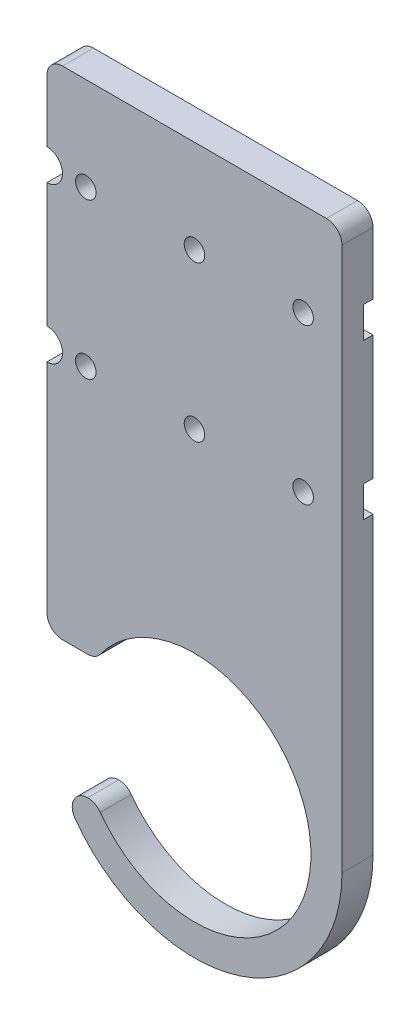
ISO-10303-21;
HEADER;
FILE_DESCRIPTION(('STEP AP214'),'2;1');
FILE_NAME('part.step','',(''),(''),'','','');
FILE_SCHEMA(('AUTOMOTIVE_DESIGN { 1 0 10303 214 1 1 1 1 }'));
ENDSEC;
DATA;
#1=APPLICATION_CONTEXT('core data for automotive mechanical design processes');
#2=APPLICATION_PROTOCOL_DEFINITION('international standard','automotive_design',2000,#1);
#3=PRODUCT_CONTEXT('',#1,'mechanical');
#4=PRODUCT('Part','Part','',(#3));
#5=PRODUCT_RELATED_PRODUCT_CATEGORY('part','',(#4));
#6=PRODUCT_DEFINITION_FORMATION('','',#4);
#7=PRODUCT_DEFINITION_CONTEXT('part definition',#1,'design');
#8=PRODUCT_DEFINITION('design','',#6,#7);
#9=PRODUCT_DEFINITION_SHAPE('','',#8);
#10=(LENGTH_UNIT() NAMED_UNIT(*) SI_UNIT(.MILLI.,.METRE.));
#11=(NAMED_UNIT(*) PLANE_ANGLE_UNIT() SI_UNIT($,.RADIAN.));
#12=(NAMED_UNIT(*) SI_UNIT($,.STERADIAN.) SOLID_ANGLE_UNIT());
#13=UNCERTAINTY_MEASURE_WITH_UNIT(LENGTH_MEASURE(1.E-05),#10,'distance_accuracy_value','');
#14=(GEOMETRIC_REPRESENTATION_CONTEXT(3) GLOBAL_UNCERTAINTY_ASSIGNED_CONTEXT((#13)) GLOBAL_UNIT_ASSIGNED_CONTEXT((#10,
#11,#12)) REPRESENTATION_CONTEXT('',''));
#15=CARTESIAN_POINT('',(0.,0.,0.));
#16=DIRECTION('',(0.,0.,1.));
#17=DIRECTION('',(1.,0.,0.));
#18=AXIS2_PLACEMENT_3D('',#15,#16,#17);
#19=CARTESIAN_POINT('',(0.,0.,0.));
#20=DIRECTION('',(0.,0.,1.));
#21=DIRECTION('',(1.,0.,0.));
#22=AXIS2_PLACEMENT_3D('',#19,#20,#21);
#23=PLANE('',#22);
#24=DIRECTION('',(-1.,0.,0.));
#25=VECTOR('',#24,1.);
#26=CARTESIAN_POINT('',(0.,180.,0.));
#27=LINE('',#26,#25);
#28=CARTESIAN_POINT('',(42.5,180.,0.));
#29=VERTEX_POINT('',#28);
#30=CARTESIAN_POINT('',(-42.5,180.,0.));
#31=VERTEX_POINT('',#30);
#32=EDGE_CURVE('E343',#29,#31,#27,.T.);
#33=ORIENTED_EDGE('',*,*,#32,.F.);
#34=CARTESIAN_POINT('',(42.5,175.,0.));
#35=DIRECTION('',(0.,0.,1.));
#36=DIRECTION('',(1.,0.,0.));
#37=AXIS2_PLACEMENT_3D('',#34,#35,#36);
#38=CIRCLE('',#37,5.);
#39=CARTESIAN_POINT('',(47.5,175.,0.));
#40=VERTEX_POINT('',#39);
#41=EDGE_CURVE('E320',#29,#40,#38,.F.);
#42=ORIENTED_EDGE('',*,*,#41,.T.);
#43=DIRECTION('',(0.,1.,0.));
#44=VECTOR('',#43,1.);
#45=CARTESIAN_POINT('',(47.5,0.,0.));
#46=LINE('',#45,#44);
#47=CARTESIAN_POINT('',(47.5,155.,0.));
#48=VERTEX_POINT('',#47);
#49=EDGE_CURVE('E341',#48,#40,#46,.T.);
#50=ORIENTED_EDGE('',*,*,#49,.F.);
#51=DIRECTION('',(1.,0.,0.));
#52=VECTOR('',#51,1.);
#53=CARTESIAN_POINT('',(0.,155.,0.));
#54=LINE('',#53,#52);
#55=CARTESIAN_POINT('',(-47.5,155.,0.));
#56=VERTEX_POINT('',#55);
#57=EDGE_CURVE('E600',#56,#48,#54,.T.);
#58=ORIENTED_EDGE('',*,*,#57,.F.);
#59=DIRECTION('',(0.,1.,0.));
#60=VECTOR('',#59,1.);
#61=CARTESIAN_POINT('',(-47.5,0.,0.));
#62=LINE('',#61,#60);
#63=CARTESIAN_POINT('',(-47.5,175.,0.));
#64=VERTEX_POINT('',#63);
#65=EDGE_CURVE('E366',#56,#64,#62,.T.);
#66=ORIENTED_EDGE('',*,*,#65,.T.);
#67=CARTESIAN_POINT('',(-42.5,175.,0.));
#68=DIRECTION('',(0.,0.,1.));
#69=DIRECTION('',(1.,0.,0.));
#70=AXIS2_PLACEMENT_3D('',#67,#68,#69);
#71=CIRCLE('',#70,5.);
#72=EDGE_CURVE('E313',#64,#31,#71,.F.);
#73=ORIENTED_EDGE('',*,*,#72,.T.);
#74=EDGE_LOOP('',(#33,#42,#50,#58,#66,#73));
#75=FACE_BOUND('',#74,.T.);
#76=ADVANCED_FACE('F46',(#75),#23,.F.);
#77=DIRECTION('',(0.,1.,0.));
#78=VECTOR('',#77,1.);
#79=CARTESIAN_POINT('',(-47.5,0.,0.));
#80=LINE('',#79,#78);
#81=CARTESIAN_POINT('',(-47.5,105.,0.));
#82=VERTEX_POINT('',#81);
#83=CARTESIAN_POINT('',(-47.5,145.,0.));
#84=VERTEX_POINT('',#83);
#85=EDGE_CURVE('E367',#82,#84,#80,.T.);
#86=ORIENTED_EDGE('',*,*,#85,.T.);
#87=DIRECTION('',(1.,0.,0.));
#88=VECTOR('',#87,1.);
#89=CARTESIAN_POINT('',(0.,145.,0.));
#90=LINE('',#89,#88);
#91=CARTESIAN_POINT('',(47.5,145.,0.));
#92=VERTEX_POINT('',#91);
#93=EDGE_CURVE('E207',#84,#92,#90,.T.);
#94=ORIENTED_EDGE('',*,*,#93,.T.);
#95=CARTESIAN_POINT('',(47.5,105.,0.));
#96=VERTEX_POINT('',#95);
#97=EDGE_CURVE('E354',#96,#92,#46,.T.);
#98=ORIENTED_EDGE('',*,*,#97,.F.);
#99=DIRECTION('',(1.,0.,0.));
#100=VECTOR('',#99,1.);
#101=CARTESIAN_POINT('',(-47.5,105.,0.));
#102=LINE('',#101,#100);
#103=EDGE_CURVE('E631',#82,#96,#102,.T.);
#104=ORIENTED_EDGE('',*,*,#103,.F.);
#105=EDGE_LOOP('',(#86,#94,#98,#104));
#106=FACE_BOUND('',#105,.T.);
#107=ADVANCED_FACE('F488',(#106),#23,.F.);
#108=CARTESIAN_POINT('',(0.,0.,10.));
#109=DIRECTION('',(0.,0.,-1.));
#110=DIRECTION('',(-1.,0.,0.));
#111=AXIS2_PLACEMENT_3D('',#108,#109,#110);
#112=CYLINDRICAL_SURFACE('',#111,37.5);
#113=CARTESIAN_POINT('',(0.,0.,10.));
#114=DIRECTION('',(0.,0.,1.));
#115=DIRECTION('',(1.,0.,0.));
#116=AXIS2_PLACEMENT_3D('',#113,#114,#115);
#117=CIRCLE('',#116,37.5);
#118=CARTESIAN_POINT('',(-30.3258685695607,-22.0588235294118,10.));
#119=VERTEX_POINT('',#118);
#120=CARTESIAN_POINT('',(-30.3258685695607,22.0588235294118,10.));
#121=VERTEX_POINT('',#120);
#122=EDGE_CURVE('E379',#119,#121,#117,.T.);
#123=ORIENTED_EDGE('',*,*,#122,.T.);
#124=DIRECTION('',(0.,0.,-1.));
#125=VECTOR('',#124,1.);
#126=CARTESIAN_POINT('',(-30.3258685695607,22.0588235294118,10.));
#127=LINE('',#126,#125);
#128=CARTESIAN_POINT('',(-30.3258685695607,22.0588235294118,0.));
#129=VERTEX_POINT('',#128);
#130=EDGE_CURVE('E263',#121,#129,#127,.T.);
#131=ORIENTED_EDGE('',*,*,#130,.T.);
#132=CARTESIAN_POINT('',(0.,0.,0.));
#133=DIRECTION('',(0.,0.,1.));
#134=DIRECTION('',(1.,0.,0.));
#135=AXIS2_PLACEMENT_3D('',#132,#133,#134);
#136=CIRCLE('',#135,37.5);
#137=CARTESIAN_POINT('',(-30.3258685695607,-22.0588235294118,0.));
#138=VERTEX_POINT('',#137);
#139=EDGE_CURVE('E356',#138,#129,#136,.T.);
#140=ORIENTED_EDGE('',*,*,#139,.F.);
#141=DIRECTION('',(0.,0.,-1.));
#142=VECTOR('',#141,1.);
#143=CARTESIAN_POINT('',(-30.3258685695607,-22.0588235294118,10.));
#144=LINE('',#143,#142);
#145=EDGE_CURVE('E254',#138,#119,#144,.F.);
#146=ORIENTED_EDGE('',*,*,#145,.T.);
#147=EDGE_LOOP('',(#123,#131,#140,#146));
#148=FACE_BOUND('',#147,.T.);
#149=ADVANCED_FACE('F491',(#148),#112,.F.);
#150=CARTESIAN_POINT('',(0.,0.,10.));
#151=DIRECTION('',(0.,0.,-1.));
#152=DIRECTION('',(-1.,0.,0.));
#153=AXIS2_PLACEMENT_3D('',#150,#151,#152);
#154=CYLINDRICAL_SURFACE('',#153,47.5);
#155=CARTESIAN_POINT('',(0.,0.,10.));
#156=DIRECTION('',(0.,0.,1.));
#157=DIRECTION('',(1.,0.,0.));
#158=AXIS2_PLACEMENT_3D('',#155,#156,#157);
#159=CIRCLE('',#158,47.5);
#160=CARTESIAN_POINT('',(-38.4127668547769,-27.9411764705882,10.));
#161=VERTEX_POINT('',#160);
#162=CARTESIAN_POINT('',(47.5,0.,10.));
#163=VERTEX_POINT('',#162);
#164=EDGE_CURVE('E417',#161,#163,#159,.T.);
#165=ORIENTED_EDGE('',*,*,#164,.F.);
#166=DIRECTION('',(0.,0.,-1.));
#167=VECTOR('',#166,1.);
#168=CARTESIAN_POINT('',(-38.4127668547769,-27.9411764705882,10.));
#169=LINE('',#168,#167);
#170=CARTESIAN_POINT('',(-38.4127668547769,-27.9411764705882,0.));
#171=VERTEX_POINT('',#170);
#172=EDGE_CURVE('E299',#161,#171,#169,.T.);
#173=ORIENTED_EDGE('',*,*,#172,.T.);
#174=CARTESIAN_POINT('',(0.,0.,0.));
#175=DIRECTION('',(0.,0.,1.));
#176=DIRECTION('',(1.,0.,0.));
#177=AXIS2_PLACEMENT_3D('',#174,#175,#176);
#178=CIRCLE('',#177,47.5);
#179=CARTESIAN_POINT('',(47.5,0.,0.));
#180=VERTEX_POINT('',#179);
#181=EDGE_CURVE('E351',#171,#180,#178,.T.);
#182=ORIENTED_EDGE('',*,*,#181,.T.);
#183=DIRECTION('',(0.,0.,-1.));
#184=VECTOR('',#183,1.);
#185=CARTESIAN_POINT('',(47.5,0.,10.));
#186=LINE('',#185,#184);
#187=EDGE_CURVE('E243',#163,#180,#186,.T.);
#188=ORIENTED_EDGE('',*,*,#187,.F.);
#189=EDGE_LOOP('',(#165,#173,#182,#188));
#190=FACE_BOUND('',#189,.T.);
#191=ADVANCED_FACE('F575',(#190),#154,.T.);
#192=CARTESIAN_POINT('',(47.5,0.,10.));
#193=DIRECTION('',(-1.,0.,0.));
#194=DIRECTION('',(0.,0.,1.));
#195=AXIS2_PLACEMENT_3D('',#192,#193,#194);
#196=PLANE('',#195);
#197=ORIENTED_EDGE('',*,*,#49,.T.);
#198=DIRECTION('',(0.,0.,-1.));
#199=VECTOR('',#198,1.);
#200=CARTESIAN_POINT('',(47.5,175.,10.));
#201=LINE('',#200,#199);
#202=CARTESIAN_POINT('',(47.5,175.,10.));
#203=VERTEX_POINT('',#202);
#204=EDGE_CURVE('E67',#40,#203,#201,.F.);
#205=ORIENTED_EDGE('',*,*,#204,.T.);
#206=DIRECTION('',(0.,1.,0.));
#207=VECTOR('',#206,1.);
#208=CARTESIAN_POINT('',(47.5,0.,10.));
#209=LINE('',#208,#207);
#210=EDGE_CURVE('E329',#163,#203,#209,.T.);
#211=ORIENTED_EDGE('',*,*,#210,.F.);
#212=ORIENTED_EDGE('',*,*,#187,.T.);
#213=CARTESIAN_POINT('',(47.5,95.,0.));
#214=VERTEX_POINT('',#213);
#215=EDGE_CURVE('E353',#180,#214,#46,.T.);
#216=ORIENTED_EDGE('',*,*,#215,.T.);
#217=DIRECTION('',(0.,0.,-1.));
#218=VECTOR('',#217,1.);
#219=CARTESIAN_POINT('',(47.5,95.,3.));
#220=LINE('',#219,#218);
#221=CARTESIAN_POINT('',(47.5,95.,3.));
#222=VERTEX_POINT('',#221);
#223=EDGE_CURVE('E619',#222,#214,#220,.T.);
#224=ORIENTED_EDGE('',*,*,#223,.F.);
#225=DIRECTION('',(0.,-1.,0.));
#226=VECTOR('',#225,1.);
#227=CARTESIAN_POINT('',(47.5,105.,3.));
#228=LINE('',#227,#226);
#229=CARTESIAN_POINT('',(47.5,105.,3.));
#230=VERTEX_POINT('',#229);
#231=EDGE_CURVE('E639',#230,#222,#228,.T.);
#232=ORIENTED_EDGE('',*,*,#231,.F.);
#233=DIRECTION('',(0.,0.,-1.));
#234=VECTOR('',#233,1.);
#235=CARTESIAN_POINT('',(47.5,105.,3.));
#236=LINE('',#235,#234);
#237=EDGE_CURVE('E621',#230,#96,#236,.T.);
#238=ORIENTED_EDGE('',*,*,#237,.T.);
#239=ORIENTED_EDGE('',*,*,#97,.T.);
#240=DIRECTION('',(0.,0.,-1.));
#241=VECTOR('',#240,1.);
#242=CARTESIAN_POINT('',(47.5,145.,3.));
#243=LINE('',#242,#241);
#244=CARTESIAN_POINT('',(47.5,145.,3.));
#245=VERTEX_POINT('',#244);
#246=EDGE_CURVE('E214',#245,#92,#243,.T.);
#247=ORIENTED_EDGE('',*,*,#246,.F.);
#248=DIRECTION('',(0.,1.,0.));
#249=VECTOR('',#248,1.);
#250=CARTESIAN_POINT('',(47.5,0.,3.));
#251=LINE('',#250,#249);
#252=CARTESIAN_POINT('',(47.5,155.,3.));
#253=VERTEX_POINT('',#252);
#254=EDGE_CURVE('E224',#245,#253,#251,.T.);
#255=ORIENTED_EDGE('',*,*,#254,.T.);
#256=DIRECTION('',(0.,0.,-1.));
#257=VECTOR('',#256,1.);
#258=CARTESIAN_POINT('',(47.5,155.,3.));
#259=LINE('',#258,#257);
#260=EDGE_CURVE('E349',#253,#48,#259,.T.);
#261=ORIENTED_EDGE('',*,*,#260,.T.);
#262=EDGE_LOOP('',(#197,#205,#211,#212,#216,#224,#232,#238,#239,#247,#255,#261));
#263=FACE_BOUND('',#262,.T.);
#264=ADVANCED_FACE('F350',(#263),#196,.F.);
#265=CARTESIAN_POINT('',(0.,180.,10.));
#266=DIRECTION('',(0.,-1.,0.));
#267=DIRECTION('',(0.,0.,-1.));
#268=AXIS2_PLACEMENT_3D('',#265,#266,#267);
#269=PLANE('',#268);
#270=DIRECTION('',(-1.,0.,0.));
#271=VECTOR('',#270,1.);
#272=CARTESIAN_POINT('',(0.,180.,10.));
#273=LINE('',#272,#271);
#274=CARTESIAN_POINT('',(42.5,180.,10.));
#275=VERTEX_POINT('',#274);
#276=CARTESIAN_POINT('',(-42.5,180.,10.));
#277=VERTEX_POINT('',#276);
#278=EDGE_CURVE('E326',#275,#277,#273,.T.);
#279=ORIENTED_EDGE('',*,*,#278,.F.);
#280=DIRECTION('',(0.,0.,-1.));
#281=VECTOR('',#280,1.);
#282=CARTESIAN_POINT('',(42.5,180.,10.));
#283=LINE('',#282,#281);
#284=EDGE_CURVE('E309',#275,#29,#283,.T.);
#285=ORIENTED_EDGE('',*,*,#284,.T.);
#286=ORIENTED_EDGE('',*,*,#32,.T.);
#287=DIRECTION('',(0.,0.,-1.));
#288=VECTOR('',#287,1.);
#289=CARTESIAN_POINT('',(-42.5,180.,10.));
#290=LINE('',#289,#288);
#291=EDGE_CURVE('E305',#31,#277,#290,.F.);
#292=ORIENTED_EDGE('',*,*,#291,.T.);
#293=EDGE_LOOP('',(#279,#285,#286,#292));
#294=FACE_BOUND('',#293,.T.);
#295=ADVANCED_FACE('F335',(#294),#269,.F.);
#296=CARTESIAN_POINT('',(-47.5,0.,10.));
#297=DIRECTION('',(-1.,0.,0.));
#298=DIRECTION('',(0.,0.,1.));
#299=AXIS2_PLACEMENT_3D('',#296,#297,#298);
#300=PLANE('',#299);
#301=DIRECTION('',(0.,1.,0.));
#302=VECTOR('',#301,1.);
#303=CARTESIAN_POINT('',(-47.5,0.,10.));
#304=LINE('',#303,#302);
#305=CARTESIAN_POINT('',(-47.5,155.,10.));
#306=VERTEX_POINT('',#305);
#307=CARTESIAN_POINT('',(-47.5,175.,10.));
#308=VERTEX_POINT('',#307);
#309=EDGE_CURVE('E336',#306,#308,#304,.T.);
#310=ORIENTED_EDGE('',*,*,#309,.T.);
#311=DIRECTION('',(0.,0.,-1.));
#312=VECTOR('',#311,1.);
#313=CARTESIAN_POINT('',(-47.5,175.,0.));
#314=LINE('',#313,#312);
#315=EDGE_CURVE('E11',#308,#64,#314,.T.);
#316=ORIENTED_EDGE('',*,*,#315,.T.);
#317=ORIENTED_EDGE('',*,*,#65,.F.);
#318=DIRECTION('',(0.,0.,-1.));
#319=VECTOR('',#318,1.);
#320=CARTESIAN_POINT('',(-47.5,155.,3.));
#321=LINE('',#320,#319);
#322=CARTESIAN_POINT('',(-47.5,155.,3.));
#323=VERTEX_POINT('',#322);
#324=EDGE_CURVE('E607',#323,#56,#321,.T.);
#325=ORIENTED_EDGE('',*,*,#324,.F.);
#326=DIRECTION('',(0.,0.,-1.));
#327=VECTOR('',#326,1.);
#328=CARTESIAN_POINT('',(-47.5,155.,10.));
#329=LINE('',#328,#327);
#330=EDGE_CURVE('E229',#306,#323,#329,.T.);
#331=ORIENTED_EDGE('',*,*,#330,.F.);
#332=EDGE_LOOP('',(#310,#316,#317,#325,#331));
#333=FACE_BOUND('',#332,.T.);
#334=ADVANCED_FACE('F564',(#333),#300,.T.);
#335=CARTESIAN_POINT('',(-47.5,150.,10.));
#336=DIRECTION('',(0.,0.,-1.));
#337=DIRECTION('',(-1.,0.,0.));
#338=AXIS2_PLACEMENT_3D('',#335,#336,#337);
#339=CYLINDRICAL_SURFACE('',#338,5.);
#340=CARTESIAN_POINT('',(-47.5,150.,3.));
#341=DIRECTION('',(0.,0.,1.));
#342=DIRECTION('',(1.,0.,0.));
#343=AXIS2_PLACEMENT_3D('',#340,#341,#342);
#344=CIRCLE('',#343,5.);
#345=CARTESIAN_POINT('',(-47.5,145.,3.));
#346=VERTEX_POINT('',#345);
#347=EDGE_CURVE('E216',#346,#323,#344,.T.);
#348=ORIENTED_EDGE('',*,*,#347,.F.);
#349=DIRECTION('',(0.,0.,-1.));
#350=VECTOR('',#349,1.);
#351=CARTESIAN_POINT('',(-47.5,145.,10.));
#352=LINE('',#351,#350);
#353=CARTESIAN_POINT('',(-47.5,145.,10.));
#354=VERTEX_POINT('',#353);
#355=EDGE_CURVE('E226',#354,#346,#352,.T.);
#356=ORIENTED_EDGE('',*,*,#355,.F.);
#357=CARTESIAN_POINT('',(-47.5,150.,10.));
#358=DIRECTION('',(0.,0.,1.));
#359=DIRECTION('',(1.,0.,0.));
#360=AXIS2_PLACEMENT_3D('',#357,#358,#359);
#361=CIRCLE('',#360,5.);
#362=EDGE_CURVE('E430',#354,#306,#361,.T.);
#363=ORIENTED_EDGE('',*,*,#362,.T.);
#364=ORIENTED_EDGE('',*,*,#330,.T.);
#365=EDGE_LOOP('',(#348,#356,#363,#364));
#366=FACE_BOUND('',#365,.T.);
#367=ADVANCED_FACE('F228',(#366),#339,.F.);
#368=CARTESIAN_POINT('',(-47.5,0.,10.));
#369=DIRECTION('',(-1.,0.,0.));
#370=DIRECTION('',(0.,0.,1.));
#371=AXIS2_PLACEMENT_3D('',#368,#369,#370);
#372=PLANE('',#371);
#373=ORIENTED_EDGE('',*,*,#85,.F.);
#374=DIRECTION('',(0.,0.,-1.));
#375=VECTOR('',#374,1.);
#376=CARTESIAN_POINT('',(-47.5,105.,3.));
#377=LINE('',#376,#375);
#378=CARTESIAN_POINT('',(-47.5,105.,3.));
#379=VERTEX_POINT('',#378);
#380=EDGE_CURVE('E630',#379,#82,#377,.T.);
#381=ORIENTED_EDGE('',*,*,#380,.F.);
#382=DIRECTION('',(0.,0.,-1.));
#383=VECTOR('',#382,1.);
#384=CARTESIAN_POINT('',(-47.5,105.,10.));
#385=LINE('',#384,#383);
#386=CARTESIAN_POINT('',(-47.5,105.,10.));
#387=VERTEX_POINT('',#386);
#388=EDGE_CURVE('E237',#387,#379,#385,.T.);
#389=ORIENTED_EDGE('',*,*,#388,.F.);
#390=DIRECTION('',(0.,1.,0.));
#391=VECTOR('',#390,1.);
#392=CARTESIAN_POINT('',(-47.5,0.,10.));
#393=LINE('',#392,#391);
#394=EDGE_CURVE('E240',#387,#354,#393,.T.);
#395=ORIENTED_EDGE('',*,*,#394,.T.);
#396=ORIENTED_EDGE('',*,*,#355,.T.);
#397=DIRECTION('',(0.,0.,-1.));
#398=VECTOR('',#397,1.);
#399=CARTESIAN_POINT('',(-47.5,145.,3.));
#400=LINE('',#399,#398);
#401=EDGE_CURVE('E197',#346,#84,#400,.T.);
#402=ORIENTED_EDGE('',*,*,#401,.T.);
#403=EDGE_LOOP('',(#373,#381,#389,#395,#396,#402));
#404=FACE_BOUND('',#403,.T.);
#405=ADVANCED_FACE('F232',(#404),#372,.T.);
#406=CARTESIAN_POINT('',(-47.5,100.,10.));
#407=DIRECTION('',(0.,0.,-1.));
#408=DIRECTION('',(-1.,0.,0.));
#409=AXIS2_PLACEMENT_3D('',#406,#407,#408);
#410=CYLINDRICAL_SURFACE('',#409,5.);
#411=CARTESIAN_POINT('',(-47.5,100.,3.));
#412=DIRECTION('',(0.,0.,1.));
#413=DIRECTION('',(1.,0.,0.));
#414=AXIS2_PLACEMENT_3D('',#411,#412,#413);
#415=CIRCLE('',#414,5.);
#416=CARTESIAN_POINT('',(-47.5,95.,3.));
#417=VERTEX_POINT('',#416);
#418=EDGE_CURVE('E402',#417,#379,#415,.T.);
#419=ORIENTED_EDGE('',*,*,#418,.F.);
#420=DIRECTION('',(0.,0.,-1.));
#421=VECTOR('',#420,1.);
#422=CARTESIAN_POINT('',(-47.5,95.,10.));
#423=LINE('',#422,#421);
#424=CARTESIAN_POINT('',(-47.5,95.,10.));
#425=VERTEX_POINT('',#424);
#426=EDGE_CURVE('E246',#425,#417,#423,.T.);
#427=ORIENTED_EDGE('',*,*,#426,.F.);
#428=CARTESIAN_POINT('',(-47.5,100.,10.));
#429=DIRECTION('',(0.,0.,1.));
#430=DIRECTION('',(1.,0.,0.));
#431=AXIS2_PLACEMENT_3D('',#428,#429,#430);
#432=CIRCLE('',#431,5.);
#433=EDGE_CURVE('E435',#425,#387,#432,.T.);
#434=ORIENTED_EDGE('',*,*,#433,.T.);
#435=ORIENTED_EDGE('',*,*,#388,.T.);
#436=EDGE_LOOP('',(#419,#427,#434,#435));
#437=FACE_BOUND('',#436,.T.);
#438=ADVANCED_FACE('F484',(#437),#410,.F.);
#439=CARTESIAN_POINT('',(-47.5,0.,10.));
#440=DIRECTION('',(-1.,0.,0.));
#441=DIRECTION('',(0.,0.,1.));
#442=AXIS2_PLACEMENT_3D('',#439,#440,#441);
#443=PLANE('',#442);
#444=DIRECTION('',(0.,1.,0.));
#445=VECTOR('',#444,1.);
#446=CARTESIAN_POINT('',(-47.5,0.,0.));
#447=LINE('',#446,#445);
#448=CARTESIAN_POINT('',(-47.5,25.,0.));
#449=VERTEX_POINT('',#448);
#450=CARTESIAN_POINT('',(-47.5,95.,0.));
#451=VERTEX_POINT('',#450);
#452=EDGE_CURVE('E372',#449,#451,#447,.T.);
#453=ORIENTED_EDGE('',*,*,#452,.F.);
#454=DIRECTION('',(0.,0.,-1.));
#455=VECTOR('',#454,1.);
#456=CARTESIAN_POINT('',(-47.5,25.,10.));
#457=LINE('',#456,#455);
#458=CARTESIAN_POINT('',(-47.5,25.,10.));
#459=VERTEX_POINT('',#458);
#460=EDGE_CURVE('E298',#449,#459,#457,.F.);
#461=ORIENTED_EDGE('',*,*,#460,.T.);
#462=DIRECTION('',(0.,1.,0.));
#463=VECTOR('',#462,1.);
#464=CARTESIAN_POINT('',(-47.5,0.,10.));
#465=LINE('',#464,#463);
#466=EDGE_CURVE('E436',#459,#425,#465,.T.);
#467=ORIENTED_EDGE('',*,*,#466,.T.);
#468=ORIENTED_EDGE('',*,*,#426,.T.);
#469=DIRECTION('',(0.,0.,-1.));
#470=VECTOR('',#469,1.);
#471=CARTESIAN_POINT('',(-47.5,95.,3.));
#472=LINE('',#471,#470);
#473=EDGE_CURVE('E310',#417,#451,#472,.T.);
#474=ORIENTED_EDGE('',*,*,#473,.T.);
#475=EDGE_LOOP('',(#453,#461,#467,#468,#474));
#476=FACE_BOUND('',#475,.T.);
#477=ADVANCED_FACE('F468',(#476),#443,.T.);
#478=CARTESIAN_POINT('',(0.,150.,10.));
#479=DIRECTION('',(0.,0.,-1.));
#480=DIRECTION('',(-1.,0.,0.));
#481=AXIS2_PLACEMENT_3D('',#478,#479,#480);
#482=CYLINDRICAL_SURFACE('',#481,3.3);
#483=CARTESIAN_POINT('',(0.,150.,3.));
#484=DIRECTION('',(0.,0.,1.));
#485=DIRECTION('',(1.,0.,0.));
#486=AXIS2_PLACEMENT_3D('',#483,#484,#485);
#487=CIRCLE('',#486,3.3);
#488=CARTESIAN_POINT('',(3.30000000000001,150.,3.));
#489=VERTEX_POINT('',#488);
#490=EDGE_CURVE('E601',#489,#489,#487,.T.);
#491=ORIENTED_EDGE('',*,*,#490,.F.);
#492=EDGE_LOOP('',(#491));
#493=FACE_BOUND('',#492,.T.);
#494=CARTESIAN_POINT('',(0.,150.,10.));
#495=DIRECTION('',(0.,0.,1.));
#496=DIRECTION('',(1.,0.,0.));
#497=AXIS2_PLACEMENT_3D('',#494,#495,#496);
#498=CIRCLE('',#497,3.3);
#499=CARTESIAN_POINT('',(3.30000000000001,150.,10.));
#500=VERTEX_POINT('',#499);
#501=EDGE_CURVE('E386',#500,#500,#498,.T.);
#502=ORIENTED_EDGE('',*,*,#501,.T.);
#503=EDGE_LOOP('',(#502));
#504=FACE_BOUND('',#503,.T.);
#505=ADVANCED_FACE('F466',(#493,#504),#482,.F.);
#506=CARTESIAN_POINT('',(35.,150.,10.));
#507=DIRECTION('',(0.,0.,-1.));
#508=DIRECTION('',(-1.,0.,0.));
#509=AXIS2_PLACEMENT_3D('',#506,#507,#508);
#510=CYLINDRICAL_SURFACE('',#509,3.3);
#511=CARTESIAN_POINT('',(35.,150.,3.));
#512=DIRECTION('',(0.,0.,1.));
#513=DIRECTION('',(1.,0.,0.));
#514=AXIS2_PLACEMENT_3D('',#511,#512,#513);
#515=CIRCLE('',#514,3.3);
#516=CARTESIAN_POINT('',(38.3,150.,3.));
#517=VERTEX_POINT('',#516);
#518=EDGE_CURVE('E599',#517,#517,#515,.T.);
#519=ORIENTED_EDGE('',*,*,#518,.F.);
#520=EDGE_LOOP('',(#519));
#521=FACE_BOUND('',#520,.T.);
#522=CARTESIAN_POINT('',(35.,150.,10.));
#523=DIRECTION('',(0.,0.,1.));
#524=DIRECTION('',(1.,0.,0.));
#525=AXIS2_PLACEMENT_3D('',#522,#523,#524);
#526=CIRCLE('',#525,3.3);
#527=CARTESIAN_POINT('',(38.3,150.,10.));
#528=VERTEX_POINT('',#527);
#529=EDGE_CURVE('E392',#528,#528,#526,.T.);
#530=ORIENTED_EDGE('',*,*,#529,.T.);
#531=EDGE_LOOP('',(#530));
#532=FACE_BOUND('',#531,.T.);
#533=ADVANCED_FACE('F456',(#521,#532),#510,.F.);
#534=CARTESIAN_POINT('',(35.,100.,10.));
#535=DIRECTION('',(0.,0.,-1.));
#536=DIRECTION('',(-1.,0.,0.));
#537=AXIS2_PLACEMENT_3D('',#534,#535,#536);
#538=CYLINDRICAL_SURFACE('',#537,3.3);
#539=CARTESIAN_POINT('',(35.,100.,3.));
#540=DIRECTION('',(0.,0.,1.));
#541=DIRECTION('',(1.,0.,0.));
#542=AXIS2_PLACEMENT_3D('',#539,#540,#541);
#543=CIRCLE('',#542,3.3);
#544=CARTESIAN_POINT('',(38.3,100.,3.));
#545=VERTEX_POINT('',#544);
#546=EDGE_CURVE('E403',#545,#545,#543,.T.);
#547=ORIENTED_EDGE('',*,*,#546,.F.);
#548=EDGE_LOOP('',(#547));
#549=FACE_BOUND('',#548,.T.);
#550=CARTESIAN_POINT('',(35.,100.,10.));
#551=DIRECTION('',(0.,0.,1.));
#552=DIRECTION('',(1.,0.,0.));
#553=AXIS2_PLACEMENT_3D('',#550,#551,#552);
#554=CIRCLE('',#553,3.3);
#555=CARTESIAN_POINT('',(38.3,100.,10.));
#556=VERTEX_POINT('',#555);
#557=EDGE_CURVE('E452',#556,#556,#554,.T.);
#558=ORIENTED_EDGE('',*,*,#557,.T.);
#559=EDGE_LOOP('',(#558));
#560=FACE_BOUND('',#559,.T.);
#561=ADVANCED_FACE('F480',(#549,#560),#538,.F.);
#562=CARTESIAN_POINT('',(0.,100.,10.));
#563=DIRECTION('',(0.,0.,-1.));
#564=DIRECTION('',(-1.,0.,0.));
#565=AXIS2_PLACEMENT_3D('',#562,#563,#564);
#566=CYLINDRICAL_SURFACE('',#565,3.3);
#567=CARTESIAN_POINT('',(0.,100.,3.));
#568=DIRECTION('',(0.,0.,1.));
#569=DIRECTION('',(1.,0.,0.));
#570=AXIS2_PLACEMENT_3D('',#567,#568,#569);
#571=CIRCLE('',#570,3.3);
#572=CARTESIAN_POINT('',(3.30000000000001,100.,3.));
#573=VERTEX_POINT('',#572);
#574=EDGE_CURVE('E260',#573,#573,#571,.T.);
#575=ORIENTED_EDGE('',*,*,#574,.F.);
#576=EDGE_LOOP('',(#575));
#577=FACE_BOUND('',#576,.T.);
#578=CARTESIAN_POINT('',(0.,100.,10.));
#579=DIRECTION('',(0.,0.,1.));
#580=DIRECTION('',(1.,0.,0.));
#581=AXIS2_PLACEMENT_3D('',#578,#579,#580);
#582=CIRCLE('',#581,3.3);
#583=CARTESIAN_POINT('',(3.30000000000001,100.,10.));
#584=VERTEX_POINT('',#583);
#585=EDGE_CURVE('E450',#584,#584,#582,.T.);
#586=ORIENTED_EDGE('',*,*,#585,.T.);
#587=EDGE_LOOP('',(#586));
#588=FACE_BOUND('',#587,.T.);
#589=ADVANCED_FACE('F538',(#577,#588),#566,.F.);
#590=CARTESIAN_POINT('',(-35.,100.,10.));
#591=DIRECTION('',(0.,0.,-1.));
#592=DIRECTION('',(-1.,0.,0.));
#593=AXIS2_PLACEMENT_3D('',#590,#591,#592);
#594=CYLINDRICAL_SURFACE('',#593,3.3);
#595=CARTESIAN_POINT('',(-35.,100.,3.));
#596=DIRECTION('',(0.,0.,1.));
#597=DIRECTION('',(1.,0.,0.));
#598=AXIS2_PLACEMENT_3D('',#595,#596,#597);
#599=CIRCLE('',#598,3.3);
#600=CARTESIAN_POINT('',(-31.7,100.,3.));
#601=VERTEX_POINT('',#600);
#602=EDGE_CURVE('E215',#601,#601,#599,.T.);
#603=ORIENTED_EDGE('',*,*,#602,.F.);
#604=EDGE_LOOP('',(#603));
#605=FACE_BOUND('',#604,.T.);
#606=CARTESIAN_POINT('',(-35.,100.,10.));
#607=DIRECTION('',(0.,0.,1.));
#608=DIRECTION('',(1.,0.,0.));
#609=AXIS2_PLACEMENT_3D('',#606,#607,#608);
#610=CIRCLE('',#609,3.3);
#611=CARTESIAN_POINT('',(-31.7,100.,10.));
#612=VERTEX_POINT('',#611);
#613=EDGE_CURVE('E442',#612,#612,#610,.T.);
#614=ORIENTED_EDGE('',*,*,#613,.T.);
#615=EDGE_LOOP('',(#614));
#616=FACE_BOUND('',#615,.T.);
#617=ADVANCED_FACE('F537',(#605,#616),#594,.F.);
#618=CARTESIAN_POINT('',(0.,20.,10.));
#619=DIRECTION('',(0.,1.,0.));
#620=DIRECTION('',(-1.,0.,0.));
#621=AXIS2_PLACEMENT_3D('',#618,#619,#620);
#622=PLANE('',#621);
#623=DIRECTION('',(1.,0.,0.));
#624=VECTOR('',#623,1.);
#625=CARTESIAN_POINT('',(0.,20.,0.));
#626=LINE('',#625,#624);
#627=CARTESIAN_POINT('',(-42.5,20.,0.));
#628=VERTEX_POINT('',#627);
#629=CARTESIAN_POINT('',(-34.3693177121688,20.,0.));
#630=VERTEX_POINT('',#629);
#631=EDGE_CURVE('E380',#628,#630,#626,.T.);
#632=ORIENTED_EDGE('',*,*,#631,.T.);
#633=DIRECTION('',(0.,0.,1.));
#634=VECTOR('',#633,1.);
#635=CARTESIAN_POINT('',(-34.3693177121688,20.,10.));
#636=LINE('',#635,#634);
#637=CARTESIAN_POINT('',(-34.3693177121688,20.,10.));
#638=VERTEX_POINT('',#637);
#639=EDGE_CURVE('E283',#630,#638,#636,.T.);
#640=ORIENTED_EDGE('',*,*,#639,.T.);
#641=DIRECTION('',(1.,0.,0.));
#642=VECTOR('',#641,1.);
#643=CARTESIAN_POINT('',(0.,20.,10.));
#644=LINE('',#643,#642);
#645=CARTESIAN_POINT('',(-42.5,20.,10.));
#646=VERTEX_POINT('',#645);
#647=EDGE_CURVE('E437',#646,#638,#644,.T.);
#648=ORIENTED_EDGE('',*,*,#647,.F.);
#649=DIRECTION('',(0.,0.,-1.));
#650=VECTOR('',#649,1.);
#651=CARTESIAN_POINT('',(-42.5,20.,0.));
#652=LINE('',#651,#650);
#653=EDGE_CURVE('E280',#646,#628,#652,.T.);
#654=ORIENTED_EDGE('',*,*,#653,.T.);
#655=EDGE_LOOP('',(#632,#640,#648,#654));
#656=FACE_BOUND('',#655,.T.);
#657=ADVANCED_FACE('F536',(#656),#622,.F.);
#658=CARTESIAN_POINT('',(-35.,150.,10.));
#659=DIRECTION('',(0.,0.,-1.));
#660=DIRECTION('',(-1.,0.,0.));
#661=AXIS2_PLACEMENT_3D('',#658,#659,#660);
#662=CYLINDRICAL_SURFACE('',#661,3.3);
#663=CARTESIAN_POINT('',(-35.,150.,3.));
#664=DIRECTION('',(0.,0.,1.));
#665=DIRECTION('',(1.,0.,0.));
#666=AXIS2_PLACEMENT_3D('',#663,#664,#665);
#667=CIRCLE('',#666,3.3);
#668=CARTESIAN_POINT('',(-31.7,150.,3.));
#669=VERTEX_POINT('',#668);
#670=EDGE_CURVE('E235',#669,#669,#667,.T.);
#671=ORIENTED_EDGE('',*,*,#670,.F.);
#672=EDGE_LOOP('',(#671));
#673=FACE_BOUND('',#672,.T.);
#674=CARTESIAN_POINT('',(-35.,150.,10.));
#675=DIRECTION('',(0.,0.,1.));
#676=DIRECTION('',(1.,0.,0.));
#677=AXIS2_PLACEMENT_3D('',#674,#675,#676);
#678=CIRCLE('',#677,3.3);
#679=CARTESIAN_POINT('',(-31.7,150.,10.));
#680=VERTEX_POINT('',#679);
#681=EDGE_CURVE('E384',#680,#680,#678,.T.);
#682=ORIENTED_EDGE('',*,*,#681,.T.);
#683=EDGE_LOOP('',(#682));
#684=FACE_BOUND('',#683,.T.);
#685=ADVANCED_FACE('F465',(#673,#684),#662,.F.);
#686=CARTESIAN_POINT('',(0.,0.,10.));
#687=DIRECTION('',(0.,0.,1.));
#688=DIRECTION('',(1.,0.,0.));
#689=AXIS2_PLACEMENT_3D('',#686,#687,#688);
#690=PLANE('',#689);
#691=ORIENTED_EDGE('',*,*,#210,.T.);
#692=CARTESIAN_POINT('',(42.5,175.,10.));
#693=DIRECTION('',(0.,0.,1.));
#694=DIRECTION('',(1.,0.,0.));
#695=AXIS2_PLACEMENT_3D('',#692,#693,#694);
#696=CIRCLE('',#695,5.);
#697=EDGE_CURVE('E54',#203,#275,#696,.T.);
#698=ORIENTED_EDGE('',*,*,#697,.T.);
#699=ORIENTED_EDGE('',*,*,#278,.T.);
#700=CARTESIAN_POINT('',(-42.5,175.,10.));
#701=DIRECTION('',(0.,0.,1.));
#702=DIRECTION('',(1.,0.,0.));
#703=AXIS2_PLACEMENT_3D('',#700,#701,#702);
#704=CIRCLE('',#703,5.);
#705=EDGE_CURVE('E65',#277,#308,#704,.T.);
#706=ORIENTED_EDGE('',*,*,#705,.T.);
#707=ORIENTED_EDGE('',*,*,#309,.F.);
#708=ORIENTED_EDGE('',*,*,#362,.F.);
#709=ORIENTED_EDGE('',*,*,#394,.F.);
#710=ORIENTED_EDGE('',*,*,#433,.F.);
#711=ORIENTED_EDGE('',*,*,#466,.F.);
#712=CARTESIAN_POINT('',(-42.5,25.,10.));
#713=DIRECTION('',(0.,0.,1.));
#714=DIRECTION('',(1.,0.,0.));
#715=AXIS2_PLACEMENT_3D('',#712,#713,#714);
#716=CIRCLE('',#715,5.);
#717=EDGE_CURVE('E287',#459,#646,#716,.T.);
#718=ORIENTED_EDGE('',*,*,#717,.T.);
#719=ORIENTED_EDGE('',*,*,#647,.T.);
#720=CARTESIAN_POINT('',(-34.3693177121688,25.,10.));
#721=DIRECTION('',(0.,0.,1.));
#722=DIRECTION('',(1.,0.,0.));
#723=AXIS2_PLACEMENT_3D('',#720,#721,#722);
#724=CIRCLE('',#723,5.);
#725=EDGE_CURVE('E291',#638,#121,#724,.T.);
#726=ORIENTED_EDGE('',*,*,#725,.T.);
#727=ORIENTED_EDGE('',*,*,#122,.F.);
#728=CARTESIAN_POINT('',(-34.3693177121688,-25.,10.));
#729=DIRECTION('',(0.,0.,1.));
#730=DIRECTION('',(1.,0.,0.));
#731=AXIS2_PLACEMENT_3D('',#728,#729,#730);
#732=CIRCLE('',#731,5.);
#733=CARTESIAN_POINT('',(-34.3693177121688,-20.,10.));
#734=VERTEX_POINT('',#733);
#735=EDGE_CURVE('E286',#119,#734,#732,.T.);
#736=ORIENTED_EDGE('',*,*,#735,.T.);
#737=CARTESIAN_POINT('',(-34.3693177121688,-25.,10.));
#738=DIRECTION('',(0.,0.,1.));
#739=DIRECTION('',(1.,0.,0.));
#740=AXIS2_PLACEMENT_3D('',#737,#738,#739);
#741=CIRCLE('',#740,5.);
#742=EDGE_CURVE('E284',#734,#161,#741,.T.);
#743=ORIENTED_EDGE('',*,*,#742,.T.);
#744=ORIENTED_EDGE('',*,*,#164,.T.);
#745=EDGE_LOOP('',(#691,#698,#699,#706,#707,#708,#709,#710,#711,#718,#719,#726,#727,#736,#743,#744));
#746=FACE_BOUND('',#745,.T.);
#747=ORIENTED_EDGE('',*,*,#613,.F.);
#748=EDGE_LOOP('',(#747));
#749=FACE_BOUND('',#748,.T.);
#750=ORIENTED_EDGE('',*,*,#585,.F.);
#751=EDGE_LOOP('',(#750));
#752=FACE_BOUND('',#751,.T.);
#753=ORIENTED_EDGE('',*,*,#557,.F.);
#754=EDGE_LOOP('',(#753));
#755=FACE_BOUND('',#754,.T.);
#756=ORIENTED_EDGE('',*,*,#529,.F.);
#757=EDGE_LOOP('',(#756));
#758=FACE_BOUND('',#757,.T.);
#759=ORIENTED_EDGE('',*,*,#501,.F.);
#760=EDGE_LOOP('',(#759));
#761=FACE_BOUND('',#760,.T.);
#762=ORIENTED_EDGE('',*,*,#681,.F.);
#763=EDGE_LOOP('',(#762));
#764=FACE_BOUND('',#763,.T.);
#765=ADVANCED_FACE('F328',(#746,#749,#752,#755,#758,#761,#764),#690,.T.);
#766=ORIENTED_EDGE('',*,*,#139,.T.);
#767=CARTESIAN_POINT('',(-34.3693177121688,25.,0.));
#768=DIRECTION('',(0.,0.,1.));
#769=DIRECTION('',(1.,0.,0.));
#770=AXIS2_PLACEMENT_3D('',#767,#768,#769);
#771=CIRCLE('',#770,5.);
#772=EDGE_CURVE('E274',#129,#630,#771,.F.);
#773=ORIENTED_EDGE('',*,*,#772,.T.);
#774=ORIENTED_EDGE('',*,*,#631,.F.);
#775=CARTESIAN_POINT('',(-42.5,25.,0.));
#776=DIRECTION('',(0.,0.,1.));
#777=DIRECTION('',(1.,0.,0.));
#778=AXIS2_PLACEMENT_3D('',#775,#776,#777);
#779=CIRCLE('',#778,5.);
#780=EDGE_CURVE('E272',#628,#449,#779,.F.);
#781=ORIENTED_EDGE('',*,*,#780,.T.);
#782=ORIENTED_EDGE('',*,*,#452,.T.);
#783=DIRECTION('',(1.,0.,0.));
#784=VECTOR('',#783,1.);
#785=CARTESIAN_POINT('',(-47.5,95.,0.));
#786=LINE('',#785,#784);
#787=EDGE_CURVE('E608',#451,#214,#786,.T.);
#788=ORIENTED_EDGE('',*,*,#787,.T.);
#789=ORIENTED_EDGE('',*,*,#215,.F.);
#790=ORIENTED_EDGE('',*,*,#181,.F.);
#791=CARTESIAN_POINT('',(-34.3693177121688,-25.,0.));
#792=DIRECTION('',(0.,0.,1.));
#793=DIRECTION('',(1.,0.,0.));
#794=AXIS2_PLACEMENT_3D('',#791,#792,#793);
#795=CIRCLE('',#794,5.);
#796=CARTESIAN_POINT('',(-34.3693177121688,-20.,0.));
#797=VERTEX_POINT('',#796);
#798=EDGE_CURVE('E262',#171,#797,#795,.F.);
#799=ORIENTED_EDGE('',*,*,#798,.T.);
#800=CARTESIAN_POINT('',(-34.3693177121688,-25.,0.));
#801=DIRECTION('',(0.,0.,1.));
#802=DIRECTION('',(1.,0.,0.));
#803=AXIS2_PLACEMENT_3D('',#800,#801,#802);
#804=CIRCLE('',#803,5.);
#805=EDGE_CURVE('E270',#797,#138,#804,.F.);
#806=ORIENTED_EDGE('',*,*,#805,.T.);
#807=EDGE_LOOP('',(#766,#773,#774,#781,#782,#788,#789,#790,#799,#806));
#808=FACE_BOUND('',#807,.T.);
#809=ADVANCED_FACE('F461',(#808),#23,.F.);
#810=CARTESIAN_POINT('',(0.,145.,3.));
#811=DIRECTION('',(0.,1.,0.));
#812=DIRECTION('',(-1.,0.,0.));
#813=AXIS2_PLACEMENT_3D('',#810,#811,#812);
#814=PLANE('',#813);
#815=ORIENTED_EDGE('',*,*,#93,.F.);
#816=ORIENTED_EDGE('',*,*,#401,.F.);
#817=DIRECTION('',(1.,0.,0.));
#818=VECTOR('',#817,1.);
#819=CARTESIAN_POINT('',(0.,145.,3.));
#820=LINE('',#819,#818);
#821=EDGE_CURVE('E205',#346,#245,#820,.T.);
#822=ORIENTED_EDGE('',*,*,#821,.T.);
#823=ORIENTED_EDGE('',*,*,#246,.T.);
#824=EDGE_LOOP('',(#815,#816,#822,#823));
#825=FACE_BOUND('',#824,.T.);
#826=ADVANCED_FACE('F201',(#825),#814,.T.);
#827=CARTESIAN_POINT('',(0.,155.,3.));
#828=DIRECTION('',(0.,1.,0.));
#829=DIRECTION('',(-1.,0.,0.));
#830=AXIS2_PLACEMENT_3D('',#827,#828,#829);
#831=PLANE('',#830);
#832=ORIENTED_EDGE('',*,*,#57,.T.);
#833=ORIENTED_EDGE('',*,*,#260,.F.);
#834=DIRECTION('',(1.,0.,0.));
#835=VECTOR('',#834,1.);
#836=CARTESIAN_POINT('',(0.,155.,3.));
#837=LINE('',#836,#835);
#838=EDGE_CURVE('E615',#323,#253,#837,.T.);
#839=ORIENTED_EDGE('',*,*,#838,.F.);
#840=ORIENTED_EDGE('',*,*,#324,.T.);
#841=EDGE_LOOP('',(#832,#833,#839,#840));
#842=FACE_BOUND('',#841,.T.);
#843=ADVANCED_FACE('F501',(#842),#831,.F.);
#844=CARTESIAN_POINT('',(0.,0.,3.));
#845=DIRECTION('',(0.,0.,1.));
#846=DIRECTION('',(1.,0.,0.));
#847=AXIS2_PLACEMENT_3D('',#844,#845,#846);
#848=PLANE('',#847);
#849=ORIENTED_EDGE('',*,*,#518,.T.);
#850=EDGE_LOOP('',(#849));
#851=FACE_BOUND('',#850,.T.);
#852=ORIENTED_EDGE('',*,*,#490,.T.);
#853=EDGE_LOOP('',(#852));
#854=FACE_BOUND('',#853,.T.);
#855=ORIENTED_EDGE('',*,*,#670,.T.);
#856=EDGE_LOOP('',(#855));
#857=FACE_BOUND('',#856,.T.);
#858=ORIENTED_EDGE('',*,*,#347,.T.);
#859=ORIENTED_EDGE('',*,*,#838,.T.);
#860=ORIENTED_EDGE('',*,*,#254,.F.);
#861=ORIENTED_EDGE('',*,*,#821,.F.);
#862=EDGE_LOOP('',(#858,#859,#860,#861));
#863=FACE_BOUND('',#862,.T.);
#864=ADVANCED_FACE('F220',(#851,#854,#857,#863),#848,.F.);
#865=CARTESIAN_POINT('',(-47.5,95.,3.));
#866=DIRECTION('',(0.,1.,0.));
#867=DIRECTION('',(-1.,0.,0.));
#868=AXIS2_PLACEMENT_3D('',#865,#866,#867);
#869=PLANE('',#868);
#870=ORIENTED_EDGE('',*,*,#787,.F.);
#871=ORIENTED_EDGE('',*,*,#473,.F.);
#872=DIRECTION('',(1.,0.,0.));
#873=VECTOR('',#872,1.);
#874=CARTESIAN_POINT('',(-47.5,95.,3.));
#875=LINE('',#874,#873);
#876=EDGE_CURVE('E632',#417,#222,#875,.T.);
#877=ORIENTED_EDGE('',*,*,#876,.T.);
#878=ORIENTED_EDGE('',*,*,#223,.T.);
#879=EDGE_LOOP('',(#870,#871,#877,#878));
#880=FACE_BOUND('',#879,.T.);
#881=ADVANCED_FACE('F512',(#880),#869,.T.);
#882=CARTESIAN_POINT('',(-47.5,105.,3.));
#883=DIRECTION('',(0.,1.,0.));
#884=DIRECTION('',(-1.,0.,0.));
#885=AXIS2_PLACEMENT_3D('',#882,#883,#884);
#886=PLANE('',#885);
#887=ORIENTED_EDGE('',*,*,#103,.T.);
#888=ORIENTED_EDGE('',*,*,#237,.F.);
#889=DIRECTION('',(1.,0.,0.));
#890=VECTOR('',#889,1.);
#891=CARTESIAN_POINT('',(-47.5,105.,3.));
#892=LINE('',#891,#890);
#893=EDGE_CURVE('E629',#379,#230,#892,.T.);
#894=ORIENTED_EDGE('',*,*,#893,.F.);
#895=ORIENTED_EDGE('',*,*,#380,.T.);
#896=EDGE_LOOP('',(#887,#888,#894,#895));
#897=FACE_BOUND('',#896,.T.);
#898=ADVANCED_FACE('F511',(#897),#886,.F.);
#899=CARTESIAN_POINT('',(0.,0.,3.));
#900=DIRECTION('',(0.,0.,1.));
#901=DIRECTION('',(1.,0.,0.));
#902=AXIS2_PLACEMENT_3D('',#899,#900,#901);
#903=PLANE('',#902);
#904=ORIENTED_EDGE('',*,*,#418,.T.);
#905=ORIENTED_EDGE('',*,*,#893,.T.);
#906=ORIENTED_EDGE('',*,*,#231,.T.);
#907=ORIENTED_EDGE('',*,*,#876,.F.);
#908=EDGE_LOOP('',(#904,#905,#906,#907));
#909=FACE_BOUND('',#908,.T.);
#910=ORIENTED_EDGE('',*,*,#546,.T.);
#911=EDGE_LOOP('',(#910));
#912=FACE_BOUND('',#911,.T.);
#913=ORIENTED_EDGE('',*,*,#574,.T.);
#914=EDGE_LOOP('',(#913));
#915=FACE_BOUND('',#914,.T.);
#916=ORIENTED_EDGE('',*,*,#602,.T.);
#917=EDGE_LOOP('',(#916));
#918=FACE_BOUND('',#917,.T.);
#919=ADVANCED_FACE('F519',(#909,#912,#915,#918),#903,.F.);
#920=CARTESIAN_POINT('',(-34.3693177121688,25.,10.));
#921=DIRECTION('',(0.,0.,-1.));
#922=DIRECTION('',(-1.,0.,0.));
#923=AXIS2_PLACEMENT_3D('',#920,#921,#922);
#924=CYLINDRICAL_SURFACE('',#923,5.);
#925=ORIENTED_EDGE('',*,*,#725,.F.);
#926=ORIENTED_EDGE('',*,*,#639,.F.);
#927=ORIENTED_EDGE('',*,*,#772,.F.);
#928=ORIENTED_EDGE('',*,*,#130,.F.);
#929=EDGE_LOOP('',(#925,#926,#927,#928));
#930=FACE_BOUND('',#929,.T.);
#931=ADVANCED_FACE('F523',(#930),#924,.T.);
#932=CARTESIAN_POINT('',(-42.5,25.,10.));
#933=DIRECTION('',(0.,0.,1.));
#934=DIRECTION('',(1.,0.,0.));
#935=AXIS2_PLACEMENT_3D('',#932,#933,#934);
#936=CYLINDRICAL_SURFACE('',#935,5.);
#937=ORIENTED_EDGE('',*,*,#717,.F.);
#938=ORIENTED_EDGE('',*,*,#460,.F.);
#939=ORIENTED_EDGE('',*,*,#780,.F.);
#940=ORIENTED_EDGE('',*,*,#653,.F.);
#941=EDGE_LOOP('',(#937,#938,#939,#940));
#942=FACE_BOUND('',#941,.T.);
#943=ADVANCED_FACE('F522',(#942),#936,.T.);
#944=CARTESIAN_POINT('',(-34.3693177121688,-25.,10.));
#945=DIRECTION('',(0.,0.,-1.));
#946=DIRECTION('',(-1.,0.,0.));
#947=AXIS2_PLACEMENT_3D('',#944,#945,#946);
#948=CYLINDRICAL_SURFACE('',#947,5.);
#949=ORIENTED_EDGE('',*,*,#172,.F.);
#950=ORIENTED_EDGE('',*,*,#742,.F.);
#951=DIRECTION('',(0.,0.,1.));
#952=VECTOR('',#951,1.);
#953=CARTESIAN_POINT('',(-34.3693177121688,-20.,10.));
#954=LINE('',#953,#952);
#955=EDGE_CURVE('E303',#797,#734,#954,.T.);
#956=ORIENTED_EDGE('',*,*,#955,.F.);
#957=ORIENTED_EDGE('',*,*,#798,.F.);
#958=EDGE_LOOP('',(#949,#950,#956,#957));
#959=FACE_BOUND('',#958,.T.);
#960=ADVANCED_FACE('F578',(#959),#948,.T.);
#961=CARTESIAN_POINT('',(-34.3693177121688,-25.,10.));
#962=DIRECTION('',(0.,0.,-1.));
#963=DIRECTION('',(-1.,0.,0.));
#964=AXIS2_PLACEMENT_3D('',#961,#962,#963);
#965=CYLINDRICAL_SURFACE('',#964,5.);
#966=ORIENTED_EDGE('',*,*,#735,.F.);
#967=ORIENTED_EDGE('',*,*,#145,.F.);
#968=ORIENTED_EDGE('',*,*,#805,.F.);
#969=ORIENTED_EDGE('',*,*,#955,.T.);
#970=EDGE_LOOP('',(#966,#967,#968,#969));
#971=FACE_BOUND('',#970,.T.);
#972=ADVANCED_FACE('F585',(#971),#965,.T.);
#973=CARTESIAN_POINT('',(42.5,175.,10.));
#974=DIRECTION('',(0.,0.,-1.));
#975=DIRECTION('',(-1.,0.,0.));
#976=AXIS2_PLACEMENT_3D('',#973,#974,#975);
#977=CYLINDRICAL_SURFACE('',#976,5.);
#978=ORIENTED_EDGE('',*,*,#697,.F.);
#979=ORIENTED_EDGE('',*,*,#204,.F.);
#980=ORIENTED_EDGE('',*,*,#41,.F.);
#981=ORIENTED_EDGE('',*,*,#284,.F.);
#982=EDGE_LOOP('',(#978,#979,#980,#981));
#983=FACE_BOUND('',#982,.T.);
#984=ADVANCED_FACE('F338',(#983),#977,.T.);
#985=CARTESIAN_POINT('',(-42.5,175.,10.));
#986=DIRECTION('',(0.,0.,1.));
#987=DIRECTION('',(1.,0.,0.));
#988=AXIS2_PLACEMENT_3D('',#985,#986,#987);
#989=CYLINDRICAL_SURFACE('',#988,5.);
#990=ORIENTED_EDGE('',*,*,#705,.F.);
#991=ORIENTED_EDGE('',*,*,#291,.F.);
#992=ORIENTED_EDGE('',*,*,#72,.F.);
#993=ORIENTED_EDGE('',*,*,#315,.F.);
#994=EDGE_LOOP('',(#990,#991,#992,#993));
#995=FACE_BOUND('',#994,.T.);
#996=ADVANCED_FACE('F48',(#995),#989,.T.);
#997=CLOSED_SHELL('',(#76,#107,#149,#191,#264,#295,#334,#367,#405,#438,#477,#505,#533,#561,#589,
#617,#657,#685,#765,#809,#826,#843,#864,#881,#898,#919,#931,#943,#960,#972,#984,#996));
#998=MANIFOLD_SOLID_BREP('B2',#997);
#999=ADVANCED_BREP_SHAPE_REPRESENTATION('',(#18,#998),#14);
#1000=SHAPE_DEFINITION_REPRESENTATION(#9,#999);
ENDSEC;
END-ISO-10303-21;
